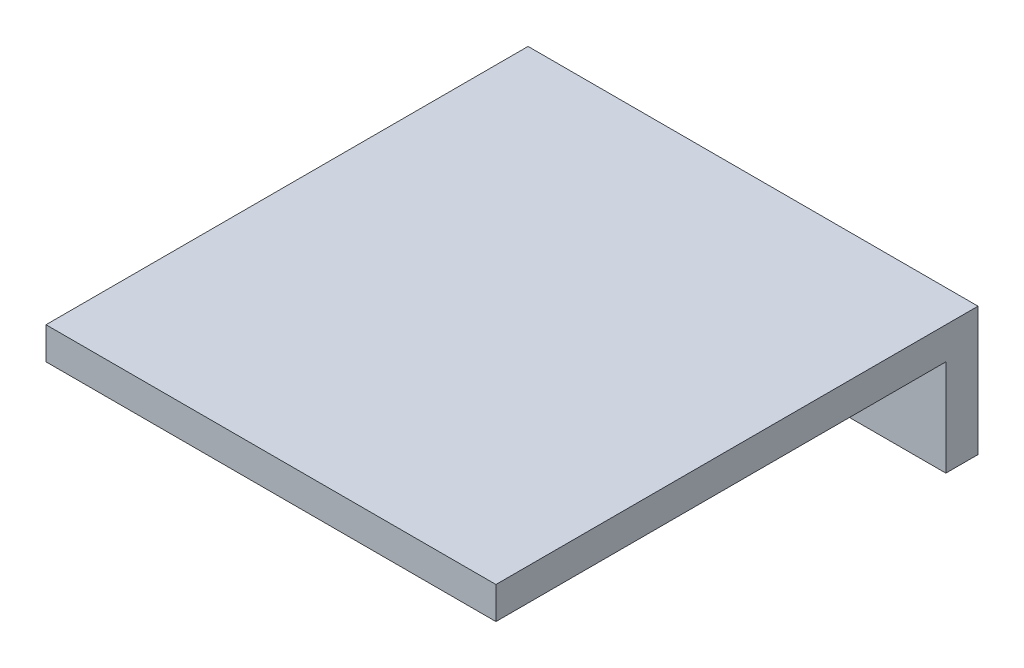
ISO-10303-21;
HEADER;
FILE_DESCRIPTION(('STEP AP214'),'2;1');
FILE_NAME('part.step','',(''),(''),'','','');
FILE_SCHEMA(('AUTOMOTIVE_DESIGN { 1 0 10303 214 1 1 1 1 }'));
ENDSEC;
DATA;
#1=APPLICATION_CONTEXT('core data for automotive mechanical design processes');
#2=APPLICATION_PROTOCOL_DEFINITION('international standard','automotive_design',2000,#1);
#3=PRODUCT_CONTEXT('',#1,'mechanical');
#4=PRODUCT('Part','Part','',(#3));
#5=PRODUCT_RELATED_PRODUCT_CATEGORY('part','',(#4));
#6=PRODUCT_DEFINITION_FORMATION('','',#4);
#7=PRODUCT_DEFINITION_CONTEXT('part definition',#1,'design');
#8=PRODUCT_DEFINITION('design','',#6,#7);
#9=PRODUCT_DEFINITION_SHAPE('','',#8);
#10=(LENGTH_UNIT() NAMED_UNIT(*) SI_UNIT(.MILLI.,.METRE.));
#11=(NAMED_UNIT(*) PLANE_ANGLE_UNIT() SI_UNIT($,.RADIAN.));
#12=(NAMED_UNIT(*) SI_UNIT($,.STERADIAN.) SOLID_ANGLE_UNIT());
#13=UNCERTAINTY_MEASURE_WITH_UNIT(LENGTH_MEASURE(1.E-05),#10,'distance_accuracy_value','');
#14=(GEOMETRIC_REPRESENTATION_CONTEXT(3) GLOBAL_UNCERTAINTY_ASSIGNED_CONTEXT((#13)) GLOBAL_UNIT_ASSIGNED_CONTEXT((#10,
#11,#12)) REPRESENTATION_CONTEXT('',''));
#15=CARTESIAN_POINT('',(0.,0.,0.));
#16=DIRECTION('',(0.,0.,1.));
#17=DIRECTION('',(1.,0.,0.));
#18=AXIS2_PLACEMENT_3D('',#15,#16,#17);
#19=CARTESIAN_POINT('',(0.,0.,5.));
#20=DIRECTION('',(-1.,0.,0.));
#21=DIRECTION('',(0.,0.,1.));
#22=AXIS2_PLACEMENT_3D('',#19,#20,#21);
#23=PLANE('',#22);
#24=DIRECTION('',(0.,1.,0.));
#25=VECTOR('',#24,1.);
#26=CARTESIAN_POINT('',(0.,0.,0.));
#27=LINE('',#26,#25);
#28=CARTESIAN_POINT('',(0.,0.,0.));
#29=VERTEX_POINT('',#28);
#30=CARTESIAN_POINT('',(0.,20.,0.));
#31=VERTEX_POINT('',#30);
#32=EDGE_CURVE('E90',#29,#31,#27,.T.);
#33=ORIENTED_EDGE('',*,*,#32,.T.);
#34=DIRECTION('',(0.,0.,-1.));
#35=VECTOR('',#34,1.);
#36=CARTESIAN_POINT('',(0.,20.,5.));
#37=LINE('',#36,#35);
#38=CARTESIAN_POINT('',(0.,20.,75.));
#39=VERTEX_POINT('',#38);
#40=EDGE_CURVE('E11',#39,#31,#37,.T.);
#41=ORIENTED_EDGE('',*,*,#40,.F.);
#42=DIRECTION('',(0.,1.,0.));
#43=VECTOR('',#42,1.);
#44=CARTESIAN_POINT('',(0.,20.,75.));
#45=LINE('',#44,#43);
#46=CARTESIAN_POINT('',(0.,15.,75.));
#47=VERTEX_POINT('',#46);
#48=EDGE_CURVE('E127',#47,#39,#45,.T.);
#49=ORIENTED_EDGE('',*,*,#48,.F.);
#50=DIRECTION('',(0.,0.,-1.));
#51=VECTOR('',#50,1.);
#52=CARTESIAN_POINT('',(0.,15.,75.));
#53=LINE('',#52,#51);
#54=CARTESIAN_POINT('',(0.,15.,5.));
#55=VERTEX_POINT('',#54);
#56=EDGE_CURVE('E99',#47,#55,#53,.T.);
#57=ORIENTED_EDGE('',*,*,#56,.T.);
#58=DIRECTION('',(0.,1.,0.));
#59=VECTOR('',#58,1.);
#60=CARTESIAN_POINT('',(0.,0.,5.));
#61=LINE('',#60,#59);
#62=CARTESIAN_POINT('',(0.,0.,5.));
#63=VERTEX_POINT('',#62);
#64=EDGE_CURVE('E84',#63,#55,#61,.T.);
#65=ORIENTED_EDGE('',*,*,#64,.F.);
#66=DIRECTION('',(0.,0.,-1.));
#67=VECTOR('',#66,1.);
#68=CARTESIAN_POINT('',(0.,0.,5.));
#69=LINE('',#68,#67);
#70=EDGE_CURVE('E77',#63,#29,#69,.T.);
#71=ORIENTED_EDGE('',*,*,#70,.T.);
#72=EDGE_LOOP('',(#33,#41,#49,#57,#65,#71));
#73=FACE_BOUND('',#72,.T.);
#74=ADVANCED_FACE('F33',(#73),#23,.F.);
#75=CARTESIAN_POINT('',(0.,20.,5.));
#76=DIRECTION('',(0.,-1.,0.));
#77=DIRECTION('',(1.,0.,0.));
#78=AXIS2_PLACEMENT_3D('',#75,#76,#77);
#79=PLANE('',#78);
#80=DIRECTION('',(-1.,0.,0.));
#81=VECTOR('',#80,1.);
#82=CARTESIAN_POINT('',(0.,20.,0.));
#83=LINE('',#82,#81);
#84=CARTESIAN_POINT('',(-70.,20.,0.));
#85=VERTEX_POINT('',#84);
#86=EDGE_CURVE('E94',#31,#85,#83,.T.);
#87=ORIENTED_EDGE('',*,*,#86,.T.);
#88=DIRECTION('',(0.,0.,-1.));
#89=VECTOR('',#88,1.);
#90=CARTESIAN_POINT('',(-70.,20.,5.));
#91=LINE('',#90,#89);
#92=CARTESIAN_POINT('',(-70.,20.,75.));
#93=VERTEX_POINT('',#92);
#94=EDGE_CURVE('E41',#93,#85,#91,.T.);
#95=ORIENTED_EDGE('',*,*,#94,.F.);
#96=DIRECTION('',(-1.,0.,0.));
#97=VECTOR('',#96,1.);
#98=CARTESIAN_POINT('',(-70.,20.,75.));
#99=LINE('',#98,#97);
#100=EDGE_CURVE('E116',#39,#93,#99,.T.);
#101=ORIENTED_EDGE('',*,*,#100,.F.);
#102=ORIENTED_EDGE('',*,*,#40,.T.);
#103=EDGE_LOOP('',(#87,#95,#101,#102));
#104=FACE_BOUND('',#103,.T.);
#105=ADVANCED_FACE('F162',(#104),#79,.F.);
#106=CARTESIAN_POINT('',(-70.,0.,5.));
#107=DIRECTION('',(1.,0.,0.));
#108=DIRECTION('',(0.,0.,-1.));
#109=AXIS2_PLACEMENT_3D('',#106,#107,#108);
#110=PLANE('',#109);
#111=DIRECTION('',(0.,-1.,0.));
#112=VECTOR('',#111,1.);
#113=CARTESIAN_POINT('',(-70.,0.,0.));
#114=LINE('',#113,#112);
#115=CARTESIAN_POINT('',(-70.,0.,0.));
#116=VERTEX_POINT('',#115);
#117=EDGE_CURVE('E85',#85,#116,#114,.T.);
#118=ORIENTED_EDGE('',*,*,#117,.T.);
#119=DIRECTION('',(0.,0.,-1.));
#120=VECTOR('',#119,1.);
#121=CARTESIAN_POINT('',(-70.,0.,5.));
#122=LINE('',#121,#120);
#123=CARTESIAN_POINT('',(-70.,0.,5.));
#124=VERTEX_POINT('',#123);
#125=EDGE_CURVE('E80',#124,#116,#122,.T.);
#126=ORIENTED_EDGE('',*,*,#125,.F.);
#127=DIRECTION('',(0.,-1.,0.));
#128=VECTOR('',#127,1.);
#129=CARTESIAN_POINT('',(-70.,0.,5.));
#130=LINE('',#129,#128);
#131=CARTESIAN_POINT('',(-70.,15.,5.));
#132=VERTEX_POINT('',#131);
#133=EDGE_CURVE('E109',#132,#124,#130,.T.);
#134=ORIENTED_EDGE('',*,*,#133,.F.);
#135=DIRECTION('',(0.,0.,-1.));
#136=VECTOR('',#135,1.);
#137=CARTESIAN_POINT('',(-70.,15.,75.));
#138=LINE('',#137,#136);
#139=CARTESIAN_POINT('',(-70.,15.,75.));
#140=VERTEX_POINT('',#139);
#141=EDGE_CURVE('E95',#140,#132,#138,.T.);
#142=ORIENTED_EDGE('',*,*,#141,.F.);
#143=DIRECTION('',(0.,-1.,0.));
#144=VECTOR('',#143,1.);
#145=CARTESIAN_POINT('',(-70.,20.,75.));
#146=LINE('',#145,#144);
#147=EDGE_CURVE('E119',#93,#140,#146,.T.);
#148=ORIENTED_EDGE('',*,*,#147,.F.);
#149=ORIENTED_EDGE('',*,*,#94,.T.);
#150=EDGE_LOOP('',(#118,#126,#134,#142,#148,#149));
#151=FACE_BOUND('',#150,.T.);
#152=ADVANCED_FACE('F166',(#151),#110,.F.);
#153=CARTESIAN_POINT('',(0.,0.,5.));
#154=DIRECTION('',(0.,1.,0.));
#155=DIRECTION('',(-1.,0.,0.));
#156=AXIS2_PLACEMENT_3D('',#153,#154,#155);
#157=PLANE('',#156);
#158=DIRECTION('',(1.,0.,0.));
#159=VECTOR('',#158,1.);
#160=CARTESIAN_POINT('',(0.,0.,0.));
#161=LINE('',#160,#159);
#162=EDGE_CURVE('E74',#116,#29,#161,.T.);
#163=ORIENTED_EDGE('',*,*,#162,.T.);
#164=ORIENTED_EDGE('',*,*,#70,.F.);
#165=DIRECTION('',(1.,0.,0.));
#166=VECTOR('',#165,1.);
#167=CARTESIAN_POINT('',(0.,0.,5.));
#168=LINE('',#167,#166);
#169=EDGE_CURVE('E55',#124,#63,#168,.T.);
#170=ORIENTED_EDGE('',*,*,#169,.F.);
#171=ORIENTED_EDGE('',*,*,#125,.T.);
#172=EDGE_LOOP('',(#163,#164,#170,#171));
#173=FACE_BOUND('',#172,.T.);
#174=ADVANCED_FACE('F76',(#173),#157,.F.);
#175=CARTESIAN_POINT('',(0.,0.,5.));
#176=DIRECTION('',(0.,0.,1.));
#177=DIRECTION('',(1.,0.,0.));
#178=AXIS2_PLACEMENT_3D('',#175,#176,#177);
#179=PLANE('',#178);
#180=CARTESIAN_POINT('',(-35.,3.26755804012146,5.));
#181=DIRECTION('',(0.,0.,1.));
#182=DIRECTION('',(1.,0.,0.));
#183=AXIS2_PLACEMENT_3D('',#180,#181,#182);
#184=CIRCLE('',#183,1.5);
#185=CARTESIAN_POINT('',(-33.5,3.26755804012146,5.));
#186=VERTEX_POINT('',#185);
#187=EDGE_CURVE('E120',#186,#186,#184,.T.);
#188=ORIENTED_EDGE('',*,*,#187,.F.);
#189=EDGE_LOOP('',(#188));
#190=FACE_BOUND('',#189,.T.);
#191=DIRECTION('',(1.,0.,0.));
#192=VECTOR('',#191,1.);
#193=CARTESIAN_POINT('',(-70.,15.,5.));
#194=LINE('',#193,#192);
#195=EDGE_CURVE('E49',#132,#55,#194,.T.);
#196=ORIENTED_EDGE('',*,*,#195,.F.);
#197=ORIENTED_EDGE('',*,*,#133,.T.);
#198=ORIENTED_EDGE('',*,*,#169,.T.);
#199=ORIENTED_EDGE('',*,*,#64,.T.);
#200=EDGE_LOOP('',(#196,#197,#198,#199));
#201=FACE_BOUND('',#200,.T.);
#202=ADVANCED_FACE('F149',(#190,#201),#179,.T.);
#203=CARTESIAN_POINT('',(0.,0.,0.));
#204=DIRECTION('',(0.,0.,1.));
#205=DIRECTION('',(1.,0.,0.));
#206=AXIS2_PLACEMENT_3D('',#203,#204,#205);
#207=PLANE('',#206);
#208=CARTESIAN_POINT('',(-35.,3.26755804012146,0.));
#209=DIRECTION('',(0.,0.,-1.));
#210=DIRECTION('',(-1.,0.,0.));
#211=AXIS2_PLACEMENT_3D('',#208,#209,#210);
#212=CIRCLE('',#211,1.5);
#213=CARTESIAN_POINT('',(-36.5,3.26755804012146,0.));
#214=VERTEX_POINT('',#213);
#215=EDGE_CURVE('E141',#214,#214,#212,.T.);
#216=ORIENTED_EDGE('',*,*,#215,.F.);
#217=EDGE_LOOP('',(#216));
#218=FACE_BOUND('',#217,.T.);
#219=ORIENTED_EDGE('',*,*,#32,.F.);
#220=ORIENTED_EDGE('',*,*,#162,.F.);
#221=ORIENTED_EDGE('',*,*,#117,.F.);
#222=ORIENTED_EDGE('',*,*,#86,.F.);
#223=EDGE_LOOP('',(#219,#220,#221,#222));
#224=FACE_BOUND('',#223,.T.);
#225=ADVANCED_FACE('F93',(#218,#224),#207,.F.);
#226=CARTESIAN_POINT('',(-70.,15.,75.));
#227=DIRECTION('',(0.,1.,0.));
#228=DIRECTION('',(-1.,0.,0.));
#229=AXIS2_PLACEMENT_3D('',#226,#227,#228);
#230=PLANE('',#229);
#231=ORIENTED_EDGE('',*,*,#195,.T.);
#232=ORIENTED_EDGE('',*,*,#56,.F.);
#233=DIRECTION('',(1.,0.,0.));
#234=VECTOR('',#233,1.);
#235=CARTESIAN_POINT('',(-70.,15.,75.));
#236=LINE('',#235,#234);
#237=EDGE_CURVE('E133',#140,#47,#236,.T.);
#238=ORIENTED_EDGE('',*,*,#237,.F.);
#239=ORIENTED_EDGE('',*,*,#141,.T.);
#240=EDGE_LOOP('',(#231,#232,#238,#239));
#241=FACE_BOUND('',#240,.T.);
#242=ADVANCED_FACE('F148',(#241),#230,.F.);
#243=CARTESIAN_POINT('',(0.,0.,75.));
#244=DIRECTION('',(0.,0.,1.));
#245=DIRECTION('',(1.,0.,0.));
#246=AXIS2_PLACEMENT_3D('',#243,#244,#245);
#247=PLANE('',#246);
#248=ORIENTED_EDGE('',*,*,#147,.T.);
#249=ORIENTED_EDGE('',*,*,#237,.T.);
#250=ORIENTED_EDGE('',*,*,#48,.T.);
#251=ORIENTED_EDGE('',*,*,#100,.T.);
#252=EDGE_LOOP('',(#248,#249,#250,#251));
#253=FACE_BOUND('',#252,.T.);
#254=ADVANCED_FACE('F155',(#253),#247,.T.);
#255=CARTESIAN_POINT('',(-35.,3.26755804012146,60.));
#256=DIRECTION('',(0.,0.,-1.));
#257=DIRECTION('',(-1.,0.,0.));
#258=AXIS2_PLACEMENT_3D('',#255,#256,#257);
#259=CYLINDRICAL_SURFACE('',#258,1.5);
#260=ORIENTED_EDGE('',*,*,#187,.T.);
#261=EDGE_LOOP('',(#260));
#262=FACE_BOUND('',#261,.T.);
#263=ORIENTED_EDGE('',*,*,#215,.T.);
#264=EDGE_LOOP('',(#263));
#265=FACE_BOUND('',#264,.T.);
#266=ADVANCED_FACE('F145',(#262,#265),#259,.F.);
#267=CLOSED_SHELL('',(#74,#105,#152,#174,#202,#225,#242,#254,#266));
#268=MANIFOLD_SOLID_BREP('B2',#267);
#269=ADVANCED_BREP_SHAPE_REPRESENTATION('',(#18,#268),#14);
#270=SHAPE_DEFINITION_REPRESENTATION(#9,#269);
ENDSEC;
END-ISO-10303-21;
